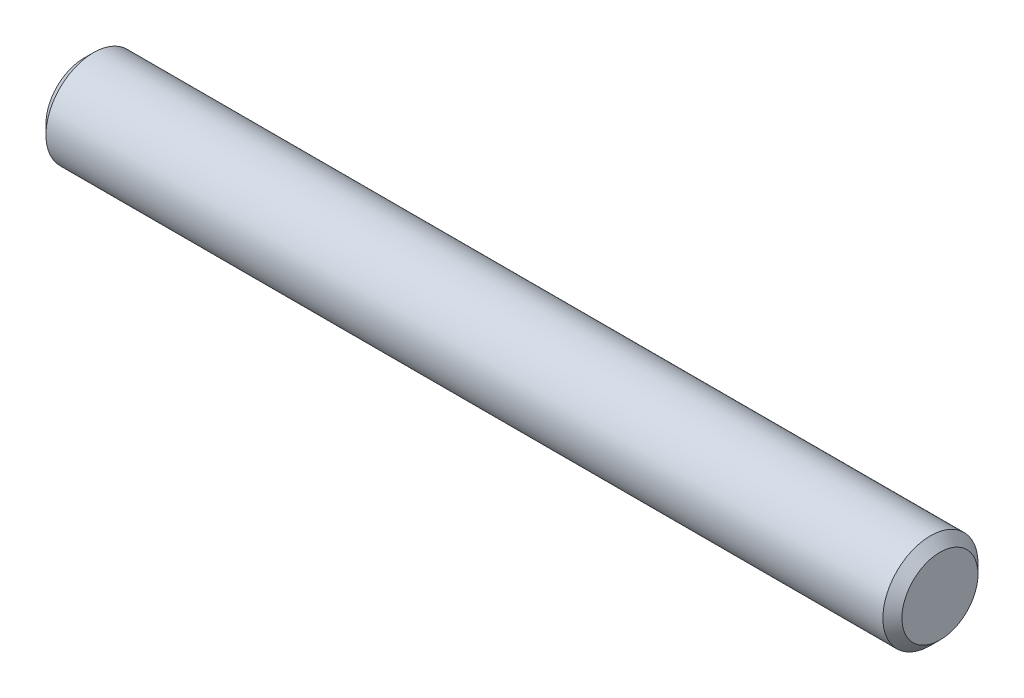
ISO-10303-21;
HEADER;
FILE_DESCRIPTION(('STEP AP214'),'2;1');
FILE_NAME('part.step','',(''),(''),'','','');
FILE_SCHEMA(('AUTOMOTIVE_DESIGN { 1 0 10303 214 1 1 1 1 }'));
ENDSEC;
DATA;
#1=APPLICATION_CONTEXT('core data for automotive mechanical design processes');
#2=APPLICATION_PROTOCOL_DEFINITION('international standard','automotive_design',2000,#1);
#3=PRODUCT_CONTEXT('',#1,'mechanical');
#4=PRODUCT('Part','Part','',(#3));
#5=PRODUCT_RELATED_PRODUCT_CATEGORY('part','',(#4));
#6=PRODUCT_DEFINITION_FORMATION('','',#4);
#7=PRODUCT_DEFINITION_CONTEXT('part definition',#1,'design');
#8=PRODUCT_DEFINITION('design','',#6,#7);
#9=PRODUCT_DEFINITION_SHAPE('','',#8);
#10=(LENGTH_UNIT() NAMED_UNIT(*) SI_UNIT(.MILLI.,.METRE.));
#11=(NAMED_UNIT(*) PLANE_ANGLE_UNIT() SI_UNIT($,.RADIAN.));
#12=(NAMED_UNIT(*) SI_UNIT($,.STERADIAN.) SOLID_ANGLE_UNIT());
#13=UNCERTAINTY_MEASURE_WITH_UNIT(LENGTH_MEASURE(1.E-05),#10,'distance_accuracy_value','');
#14=(GEOMETRIC_REPRESENTATION_CONTEXT(3) GLOBAL_UNCERTAINTY_ASSIGNED_CONTEXT((#13)) GLOBAL_UNIT_ASSIGNED_CONTEXT((#10,
#11,#12)) REPRESENTATION_CONTEXT('',''));
#15=CARTESIAN_POINT('',(0.,0.,0.));
#16=DIRECTION('',(0.,0.,1.));
#17=DIRECTION('',(1.,0.,0.));
#18=AXIS2_PLACEMENT_3D('',#15,#16,#17);
#19=CARTESIAN_POINT('',(-14.2875,0.,0.));
#20=DIRECTION('',(1.,0.,0.));
#21=DIRECTION('',(0.,0.,-1.));
#22=AXIS2_PLACEMENT_3D('',#19,#20,#21);
#23=CYLINDRICAL_SURFACE('',#22,1.5875);
#24=CARTESIAN_POINT('',(13.97,0.,0.));
#25=DIRECTION('',(1.,0.,0.));
#26=DIRECTION('',(0.,0.,-1.));
#27=AXIS2_PLACEMENT_3D('',#24,#25,#26);
#28=CIRCLE('',#27,1.5875);
#29=CARTESIAN_POINT('',(13.97,0.,-1.5875));
#30=VERTEX_POINT('',#29);
#31=EDGE_CURVE('E37',#30,#30,#28,.F.);
#32=ORIENTED_EDGE('',*,*,#31,.T.);
#33=EDGE_LOOP('',(#32));
#34=FACE_BOUND('',#33,.T.);
#35=CARTESIAN_POINT('',(-13.97,0.,0.));
#36=DIRECTION('',(1.,0.,0.));
#37=DIRECTION('',(0.,0.,-1.));
#38=AXIS2_PLACEMENT_3D('',#35,#36,#37);
#39=CIRCLE('',#38,1.5875);
#40=CARTESIAN_POINT('',(-13.97,0.,-1.5875));
#41=VERTEX_POINT('',#40);
#42=EDGE_CURVE('E41',#41,#41,#39,.T.);
#43=ORIENTED_EDGE('',*,*,#42,.T.);
#44=EDGE_LOOP('',(#43));
#45=FACE_BOUND('',#44,.T.);
#46=ADVANCED_FACE('F30',(#34,#45),#23,.T.);
#47=CARTESIAN_POINT('',(-14.2875,0.,0.));
#48=DIRECTION('',(1.,0.,0.));
#49=DIRECTION('',(0.,0.,-1.));
#50=AXIS2_PLACEMENT_3D('',#47,#48,#49);
#51=PLANE('',#50);
#52=CARTESIAN_POINT('',(-14.2875,0.,0.));
#53=DIRECTION('',(1.,0.,0.));
#54=DIRECTION('',(0.,0.,-1.));
#55=AXIS2_PLACEMENT_3D('',#52,#53,#54);
#56=CIRCLE('',#55,1.27);
#57=CARTESIAN_POINT('',(-14.2875,0.,-1.27));
#58=VERTEX_POINT('',#57);
#59=EDGE_CURVE('E10',#58,#58,#56,.F.);
#60=ORIENTED_EDGE('',*,*,#59,.T.);
#61=EDGE_LOOP('',(#60));
#62=FACE_BOUND('',#61,.T.);
#63=ADVANCED_FACE('F61',(#62),#51,.F.);
#64=CARTESIAN_POINT('',(14.2875,0.,0.));
#65=DIRECTION('',(1.,0.,0.));
#66=DIRECTION('',(0.,0.,-1.));
#67=AXIS2_PLACEMENT_3D('',#64,#65,#66);
#68=PLANE('',#67);
#69=CARTESIAN_POINT('',(14.2875,0.,0.));
#70=DIRECTION('',(1.,0.,0.));
#71=DIRECTION('',(0.,0.,-1.));
#72=AXIS2_PLACEMENT_3D('',#69,#70,#71);
#73=CIRCLE('',#72,1.27);
#74=CARTESIAN_POINT('',(14.2875,0.,-1.27));
#75=VERTEX_POINT('',#74);
#76=EDGE_CURVE('E45',#75,#75,#73,.T.);
#77=ORIENTED_EDGE('',*,*,#76,.T.);
#78=EDGE_LOOP('',(#77));
#79=FACE_BOUND('',#78,.T.);
#80=ADVANCED_FACE('F51',(#79),#68,.T.);
#81=CARTESIAN_POINT('',(14.2875,0.,0.));
#82=DIRECTION('',(-1.,0.,0.));
#83=DIRECTION('',(0.,0.,1.));
#84=AXIS2_PLACEMENT_3D('',#81,#82,#83);
#85=CONICAL_SURFACE('',#84,1.27,0.78539816339745);
#86=ORIENTED_EDGE('',*,*,#31,.F.);
#87=EDGE_LOOP('',(#86));
#88=FACE_BOUND('',#87,.T.);
#89=ORIENTED_EDGE('',*,*,#76,.F.);
#90=EDGE_LOOP('',(#89));
#91=FACE_BOUND('',#90,.T.);
#92=ADVANCED_FACE('F53',(#88,#91),#85,.T.);
#93=CARTESIAN_POINT('',(-13.97,0.,0.));
#94=DIRECTION('',(1.,0.,0.));
#95=DIRECTION('',(0.,0.,-1.));
#96=AXIS2_PLACEMENT_3D('',#93,#94,#95);
#97=CONICAL_SURFACE('',#96,1.5875,0.78539816339745);
#98=ORIENTED_EDGE('',*,*,#59,.F.);
#99=EDGE_LOOP('',(#98));
#100=FACE_BOUND('',#99,.T.);
#101=ORIENTED_EDGE('',*,*,#42,.F.);
#102=EDGE_LOOP('',(#101));
#103=FACE_BOUND('',#102,.T.);
#104=ADVANCED_FACE('F32',(#100,#103),#97,.T.);
#105=CLOSED_SHELL('',(#46,#63,#80,#92,#104));
#106=MANIFOLD_SOLID_BREP('B2',#105);
#107=ADVANCED_BREP_SHAPE_REPRESENTATION('',(#18,#106),#14);
#108=SHAPE_DEFINITION_REPRESENTATION(#9,#107);
ENDSEC;
END-ISO-10303-21;
